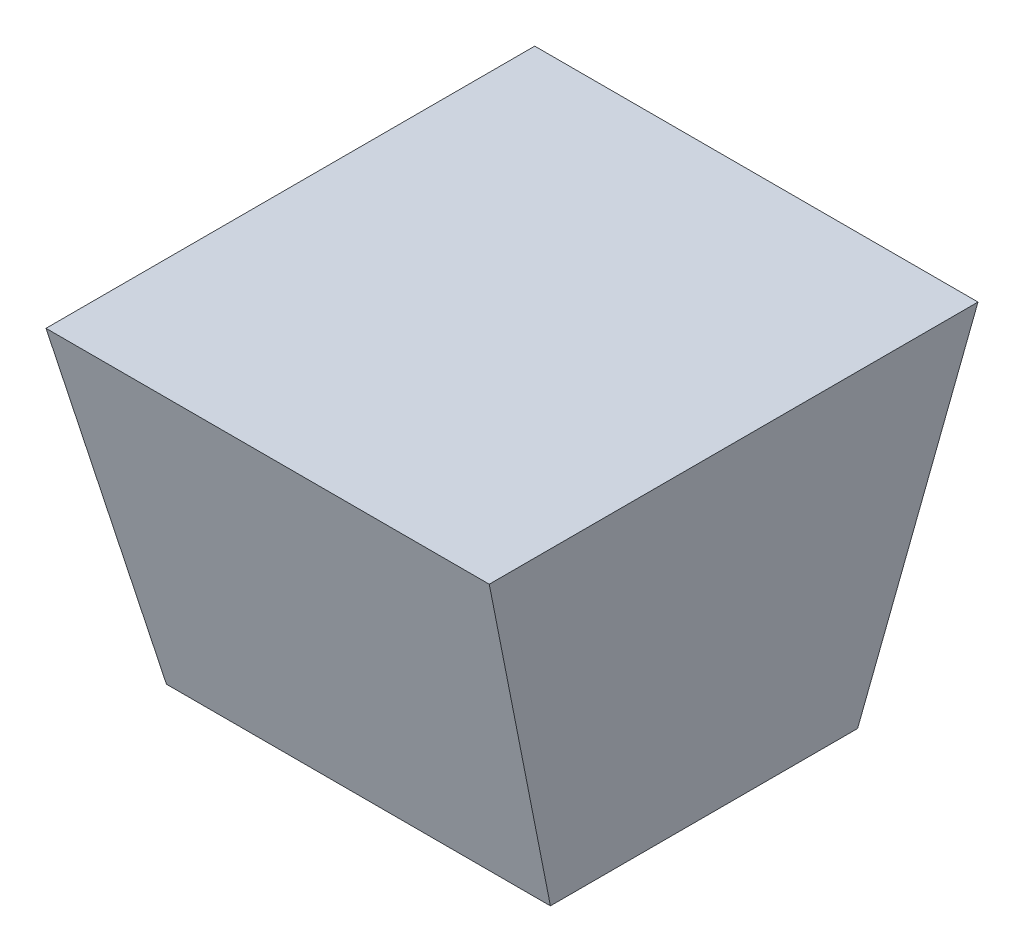
ISO-10303-21;
HEADER;
FILE_DESCRIPTION(('STEP AP214'),'2;1');
FILE_NAME('part.step','',(''),(''),'','','');
FILE_SCHEMA(('AUTOMOTIVE_DESIGN { 1 0 10303 214 1 1 1 1 }'));
ENDSEC;
DATA;
#1=APPLICATION_CONTEXT('core data for automotive mechanical design processes');
#2=APPLICATION_PROTOCOL_DEFINITION('international standard','automotive_design',2000,#1);
#3=PRODUCT_CONTEXT('',#1,'mechanical');
#4=PRODUCT('Part','Part','',(#3));
#5=PRODUCT_RELATED_PRODUCT_CATEGORY('part','',(#4));
#6=PRODUCT_DEFINITION_FORMATION('','',#4);
#7=PRODUCT_DEFINITION_CONTEXT('part definition',#1,'design');
#8=PRODUCT_DEFINITION('design','',#6,#7);
#9=PRODUCT_DEFINITION_SHAPE('','',#8);
#10=(LENGTH_UNIT() NAMED_UNIT(*) SI_UNIT(.MILLI.,.METRE.));
#11=(NAMED_UNIT(*) PLANE_ANGLE_UNIT() SI_UNIT($,.RADIAN.));
#12=(NAMED_UNIT(*) SI_UNIT($,.STERADIAN.) SOLID_ANGLE_UNIT());
#13=UNCERTAINTY_MEASURE_WITH_UNIT(LENGTH_MEASURE(1.E-05),#10,'distance_accuracy_value','');
#14=(GEOMETRIC_REPRESENTATION_CONTEXT(3) GLOBAL_UNCERTAINTY_ASSIGNED_CONTEXT((#13)) GLOBAL_UNIT_ASSIGNED_CONTEXT((#10,
#11,#12)) REPRESENTATION_CONTEXT('',''));
#15=CARTESIAN_POINT('',(0.,0.,0.));
#16=DIRECTION('',(0.,0.,1.));
#17=DIRECTION('',(1.,0.,0.));
#18=AXIS2_PLACEMENT_3D('',#15,#16,#17);
#19=CARTESIAN_POINT('',(0.,0.840435032894737,0.));
#20=DIRECTION('',(0.,1.,0.));
#21=DIRECTION('',(0.,0.,1.));
#22=AXIS2_PLACEMENT_3D('',#19,#20,#21);
#23=PLANE('',#22);
#24=DIRECTION('',(-1.,0.,0.));
#25=VECTOR('',#24,1.);
#26=CARTESIAN_POINT('',(81.0604131023871,0.840435032894737,0.606193888354969));
#27=LINE('',#26,#25);
#28=CARTESIAN_POINT('',(0.813938537808322,0.840435032894738,0.606193888354967));
#29=VERTEX_POINT('',#28);
#30=CARTESIAN_POINT('',(-0.285618537808326,0.840435032894737,0.606193888354967));
#31=VERTEX_POINT('',#30);
#32=EDGE_CURVE('E96',#29,#31,#27,.T.);
#33=ORIENTED_EDGE('',*,*,#32,.F.);
#34=DIRECTION('',(0.,0.,-1.));
#35=VECTOR('',#34,1.);
#36=CARTESIAN_POINT('',(0.813938537808327,0.840435032894737,80.8360855398669));
#37=LINE('',#36,#35);
#38=CARTESIAN_POINT('',(0.813938537808322,0.840435032894738,-0.606193888354967));
#39=VERTEX_POINT('',#38);
#40=EDGE_CURVE('E64',#29,#39,#37,.T.);
#41=ORIENTED_EDGE('',*,*,#40,.T.);
#42=DIRECTION('',(1.,0.,0.));
#43=VECTOR('',#42,1.);
#44=CARTESIAN_POINT('',(81.0604131023871,0.840435032894737,-0.606193888354969));
#45=LINE('',#44,#43);
#46=CARTESIAN_POINT('',(-0.285618537808326,0.840435032894736,-0.606193888354966));
#47=VERTEX_POINT('',#46);
#48=EDGE_CURVE('E57',#47,#39,#45,.T.);
#49=ORIENTED_EDGE('',*,*,#48,.F.);
#50=DIRECTION('',(0.,0.,1.));
#51=VECTOR('',#50,1.);
#52=CARTESIAN_POINT('',(-0.285618537808326,0.840435032894737,80.8360855398669));
#53=LINE('',#52,#51);
#54=EDGE_CURVE('E12',#47,#31,#53,.T.);
#55=ORIENTED_EDGE('',*,*,#54,.T.);
#56=EDGE_LOOP('',(#33,#41,#49,#55));
#57=FACE_BOUND('',#56,.T.);
#58=ADVANCED_FACE('F41',(#57),#23,.T.);
#59=CARTESIAN_POINT('',(81.0604131023871,0.,0.381));
#60=DIRECTION('',(0.,-0.258819045102521,0.965925826289068));
#61=DIRECTION('',(0.,-0.965925826289068,-0.258819045102521));
#62=AXIS2_PLACEMENT_3D('',#59,#60,#61);
#63=PLANE('',#62);
#64=DIRECTION('',(-0.0842074097641779,-0.962495097884607,-0.257899784197096));
#65=VECTOR('',#64,1.);
#66=CARTESIAN_POINT('',(1.30995013484898,6.50987352984572,2.12531535515091));
#67=LINE('',#66,#65);
#68=CARTESIAN_POINT('',(0.740410000000001,0.,0.381));
#69=VERTEX_POINT('',#68);
#70=EDGE_CURVE('E93',#29,#69,#67,.T.);
#71=ORIENTED_EDGE('',*,*,#70,.F.);
#72=ORIENTED_EDGE('',*,*,#32,.T.);
#73=DIRECTION('',(-0.0842074097641778,0.962495097884607,0.257899784197096));
#74=VECTOR('',#73,1.);
#75=CARTESIAN_POINT('',(0.364204205534874,-6.58707291104188,-1.3840008669986));
#76=LINE('',#75,#74);
#77=CARTESIAN_POINT('',(-0.212089999999991,0.,0.381));
#78=VERTEX_POINT('',#77);
#79=EDGE_CURVE('E83',#78,#31,#76,.T.);
#80=ORIENTED_EDGE('',*,*,#79,.F.);
#81=DIRECTION('',(-1.,0.,0.));
#82=VECTOR('',#81,1.);
#83=CARTESIAN_POINT('',(81.0604131023871,0.,0.381));
#84=LINE('',#83,#82);
#85=EDGE_CURVE('E92',#69,#78,#84,.T.);
#86=ORIENTED_EDGE('',*,*,#85,.F.);
#87=EDGE_LOOP('',(#71,#72,#80,#86));
#88=FACE_BOUND('',#87,.T.);
#89=ADVANCED_FACE('F97',(#88),#63,.T.);
#90=CARTESIAN_POINT('',(81.0604131023871,0.,-0.381));
#91=DIRECTION('',(0.,-0.258819045102521,-0.965925826289068));
#92=DIRECTION('',(0.,0.965925826289068,-0.258819045102521));
#93=AXIS2_PLACEMENT_3D('',#90,#91,#92);
#94=PLANE('',#93);
#95=DIRECTION('',(0.0842074097641778,-0.962495097884607,0.257899784197095));
#96=VECTOR('',#95,1.);
#97=CARTESIAN_POINT('',(0.364204205534874,-6.58707291104188,1.3840008669986));
#98=LINE('',#97,#96);
#99=CARTESIAN_POINT('',(-0.212089999999999,0.,-0.381000000000011));
#100=VERTEX_POINT('',#99);
#101=EDGE_CURVE('E50',#47,#100,#98,.T.);
#102=ORIENTED_EDGE('',*,*,#101,.F.);
#103=ORIENTED_EDGE('',*,*,#48,.T.);
#104=DIRECTION('',(0.0842074097641778,0.962495097884607,-0.257899784197095));
#105=VECTOR('',#104,1.);
#106=CARTESIAN_POINT('',(1.30995013484898,6.50987352984572,-2.12531535515091));
#107=LINE('',#106,#105);
#108=CARTESIAN_POINT('',(0.740409999999987,0.,-0.381));
#109=VERTEX_POINT('',#108);
#110=EDGE_CURVE('E121',#109,#39,#107,.T.);
#111=ORIENTED_EDGE('',*,*,#110,.F.);
#112=DIRECTION('',(-1.,0.,0.));
#113=VECTOR('',#112,1.);
#114=CARTESIAN_POINT('',(81.0604131023871,0.,-0.381));
#115=LINE('',#114,#113);
#116=EDGE_CURVE('E117',#109,#100,#115,.T.);
#117=ORIENTED_EDGE('',*,*,#116,.T.);
#118=EDGE_LOOP('',(#102,#103,#111,#117));
#119=FACE_BOUND('',#118,.T.);
#120=ADVANCED_FACE('F126',(#119),#94,.T.);
#121=CARTESIAN_POINT('',(0.74041,0.,80.8360855398669));
#122=DIRECTION('',(-0.996194698091745,0.0871557427476583,0.));
#123=DIRECTION('',(-0.0871557427476584,-0.996194698091746,0.));
#124=AXIS2_PLACEMENT_3D('',#121,#122,#123);
#125=PLANE('',#124);
#126=ORIENTED_EDGE('',*,*,#40,.F.);
#127=ORIENTED_EDGE('',*,*,#70,.T.);
#128=DIRECTION('',(0.,0.,-1.));
#129=VECTOR('',#128,1.);
#130=CARTESIAN_POINT('',(0.74041,0.,80.8360855398669));
#131=LINE('',#130,#129);
#132=EDGE_CURVE('E107',#69,#109,#131,.T.);
#133=ORIENTED_EDGE('',*,*,#132,.T.);
#134=ORIENTED_EDGE('',*,*,#110,.T.);
#135=EDGE_LOOP('',(#126,#127,#133,#134));
#136=FACE_BOUND('',#135,.T.);
#137=ADVANCED_FACE('F129',(#136),#125,.F.);
#138=CARTESIAN_POINT('',(-0.21209,0.,80.8360855398669));
#139=DIRECTION('',(0.996194698091745,0.0871557427476583,0.));
#140=DIRECTION('',(-0.0871557427476583,0.996194698091746,0.));
#141=AXIS2_PLACEMENT_3D('',#138,#139,#140);
#142=PLANE('',#141);
#143=ORIENTED_EDGE('',*,*,#54,.F.);
#144=ORIENTED_EDGE('',*,*,#101,.T.);
#145=DIRECTION('',(0.,0.,-1.));
#146=VECTOR('',#145,1.);
#147=CARTESIAN_POINT('',(-0.21209,0.,80.8360855398669));
#148=LINE('',#147,#146);
#149=EDGE_CURVE('E87',#78,#100,#148,.T.);
#150=ORIENTED_EDGE('',*,*,#149,.F.);
#151=ORIENTED_EDGE('',*,*,#79,.T.);
#152=EDGE_LOOP('',(#143,#144,#150,#151));
#153=FACE_BOUND('',#152,.T.);
#154=ADVANCED_FACE('F85',(#153),#142,.F.);
#155=CARTESIAN_POINT('',(0.,0.,0.));
#156=DIRECTION('',(0.,1.,0.));
#157=DIRECTION('',(0.,0.,1.));
#158=AXIS2_PLACEMENT_3D('',#155,#156,#157);
#159=PLANE('',#158);
#160=ORIENTED_EDGE('',*,*,#132,.F.);
#161=ORIENTED_EDGE('',*,*,#85,.T.);
#162=ORIENTED_EDGE('',*,*,#149,.T.);
#163=ORIENTED_EDGE('',*,*,#116,.F.);
#164=EDGE_LOOP('',(#160,#161,#162,#163));
#165=FACE_BOUND('',#164,.T.);
#166=ADVANCED_FACE('F43',(#165),#159,.F.);
#167=CLOSED_SHELL('',(#58,#89,#120,#137,#154,#166));
#168=MANIFOLD_SOLID_BREP('B2',#167);
#169=ADVANCED_BREP_SHAPE_REPRESENTATION('',(#18,#168),#14);
#170=SHAPE_DEFINITION_REPRESENTATION(#9,#169);
ENDSEC;
END-ISO-10303-21;
